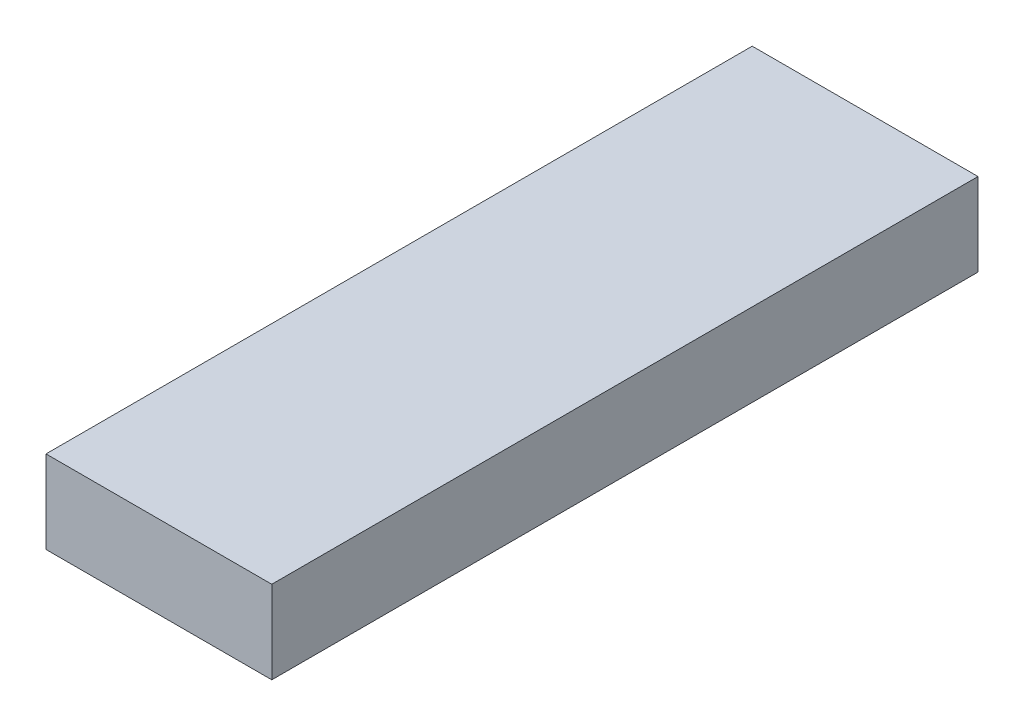
ISO-10303-21;
HEADER;
FILE_DESCRIPTION(('STEP AP214'),'2;1');
FILE_NAME('part.step','',(''),(''),'','','');
FILE_SCHEMA(('AUTOMOTIVE_DESIGN { 1 0 10303 214 1 1 1 1 }'));
ENDSEC;
DATA;
#1=APPLICATION_CONTEXT('core data for automotive mechanical design processes');
#2=APPLICATION_PROTOCOL_DEFINITION('international standard','automotive_design',2000,#1);
#3=PRODUCT_CONTEXT('',#1,'mechanical');
#4=PRODUCT('Part','Part','',(#3));
#5=PRODUCT_RELATED_PRODUCT_CATEGORY('part','',(#4));
#6=PRODUCT_DEFINITION_FORMATION('','',#4);
#7=PRODUCT_DEFINITION_CONTEXT('part definition',#1,'design');
#8=PRODUCT_DEFINITION('design','',#6,#7);
#9=PRODUCT_DEFINITION_SHAPE('','',#8);
#10=(LENGTH_UNIT() NAMED_UNIT(*) SI_UNIT(.MILLI.,.METRE.));
#11=(NAMED_UNIT(*) PLANE_ANGLE_UNIT() SI_UNIT($,.RADIAN.));
#12=(NAMED_UNIT(*) SI_UNIT($,.STERADIAN.) SOLID_ANGLE_UNIT());
#13=UNCERTAINTY_MEASURE_WITH_UNIT(LENGTH_MEASURE(1.E-05),#10,'distance_accuracy_value','');
#14=(GEOMETRIC_REPRESENTATION_CONTEXT(3) GLOBAL_UNCERTAINTY_ASSIGNED_CONTEXT((#13)) GLOBAL_UNIT_ASSIGNED_CONTEXT((#10,
#11,#12)) REPRESENTATION_CONTEXT('',''));
#15=CARTESIAN_POINT('',(0.,0.,0.));
#16=DIRECTION('',(0.,0.,1.));
#17=DIRECTION('',(1.,0.,0.));
#18=AXIS2_PLACEMENT_3D('',#15,#16,#17);
#19=CARTESIAN_POINT('',(0.,139.7,0.));
#20=DIRECTION('',(1.,0.,0.));
#21=DIRECTION('',(0.,0.,-1.));
#22=AXIS2_PLACEMENT_3D('',#19,#20,#21);
#23=PLANE('',#22);
#24=DIRECTION('',(0.,0.,1.));
#25=VECTOR('',#24,1.);
#26=CARTESIAN_POINT('',(0.,0.,0.));
#27=LINE('',#26,#25);
#28=CARTESIAN_POINT('',(0.,0.,-1191.768));
#29=VERTEX_POINT('',#28);
#30=CARTESIAN_POINT('',(0.,0.,0.));
#31=VERTEX_POINT('',#30);
#32=EDGE_CURVE('E103',#29,#31,#27,.T.);
#33=ORIENTED_EDGE('',*,*,#32,.T.);
#34=DIRECTION('',(0.,-1.,0.));
#35=VECTOR('',#34,1.);
#36=CARTESIAN_POINT('',(0.,139.7,0.));
#37=LINE('',#36,#35);
#38=CARTESIAN_POINT('',(0.,139.7,0.));
#39=VERTEX_POINT('',#38);
#40=EDGE_CURVE('E11',#39,#31,#37,.T.);
#41=ORIENTED_EDGE('',*,*,#40,.F.);
#42=DIRECTION('',(0.,0.,1.));
#43=VECTOR('',#42,1.);
#44=CARTESIAN_POINT('',(0.,139.7,0.));
#45=LINE('',#44,#43);
#46=CARTESIAN_POINT('',(0.,139.7,-1191.768));
#47=VERTEX_POINT('',#46);
#48=EDGE_CURVE('E91',#47,#39,#45,.T.);
#49=ORIENTED_EDGE('',*,*,#48,.F.);
#50=DIRECTION('',(0.,-1.,0.));
#51=VECTOR('',#50,1.);
#52=CARTESIAN_POINT('',(0.,139.7,-1191.768));
#53=LINE('',#52,#51);
#54=EDGE_CURVE('E99',#47,#29,#53,.T.);
#55=ORIENTED_EDGE('',*,*,#54,.T.);
#56=EDGE_LOOP('',(#33,#41,#49,#55));
#57=FACE_BOUND('',#56,.T.);
#58=ADVANCED_FACE('F40',(#57),#23,.F.);
#59=CARTESIAN_POINT('',(0.,139.7,0.));
#60=DIRECTION('',(0.,0.,-1.));
#61=DIRECTION('',(-1.,0.,0.));
#62=AXIS2_PLACEMENT_3D('',#59,#60,#61);
#63=PLANE('',#62);
#64=DIRECTION('',(1.,0.,0.));
#65=VECTOR('',#64,1.);
#66=CARTESIAN_POINT('',(0.,0.,0.));
#67=LINE('',#66,#65);
#68=CARTESIAN_POINT('',(381.,0.,0.));
#69=VERTEX_POINT('',#68);
#70=EDGE_CURVE('E95',#31,#69,#67,.T.);
#71=ORIENTED_EDGE('',*,*,#70,.T.);
#72=DIRECTION('',(0.,-1.,0.));
#73=VECTOR('',#72,1.);
#74=CARTESIAN_POINT('',(381.,139.7,0.));
#75=LINE('',#74,#73);
#76=CARTESIAN_POINT('',(381.,139.7,0.));
#77=VERTEX_POINT('',#76);
#78=EDGE_CURVE('E48',#77,#69,#75,.T.);
#79=ORIENTED_EDGE('',*,*,#78,.F.);
#80=DIRECTION('',(1.,0.,0.));
#81=VECTOR('',#80,1.);
#82=CARTESIAN_POINT('',(0.,139.7,0.));
#83=LINE('',#82,#81);
#84=EDGE_CURVE('E86',#39,#77,#83,.T.);
#85=ORIENTED_EDGE('',*,*,#84,.F.);
#86=ORIENTED_EDGE('',*,*,#40,.T.);
#87=EDGE_LOOP('',(#71,#79,#85,#86));
#88=FACE_BOUND('',#87,.T.);
#89=ADVANCED_FACE('F94',(#88),#63,.F.);
#90=CARTESIAN_POINT('',(381.,139.7,0.));
#91=DIRECTION('',(-1.,0.,0.));
#92=DIRECTION('',(0.,0.,1.));
#93=AXIS2_PLACEMENT_3D('',#90,#91,#92);
#94=PLANE('',#93);
#95=DIRECTION('',(0.,0.,-1.));
#96=VECTOR('',#95,1.);
#97=CARTESIAN_POINT('',(381.,0.,0.));
#98=LINE('',#97,#96);
#99=CARTESIAN_POINT('',(381.,0.,-1191.768));
#100=VERTEX_POINT('',#99);
#101=EDGE_CURVE('E73',#69,#100,#98,.T.);
#102=ORIENTED_EDGE('',*,*,#101,.T.);
#103=DIRECTION('',(0.,-1.,0.));
#104=VECTOR('',#103,1.);
#105=CARTESIAN_POINT('',(381.,139.7,-1191.768));
#106=LINE('',#105,#104);
#107=CARTESIAN_POINT('',(381.,139.7,-1191.768));
#108=VERTEX_POINT('',#107);
#109=EDGE_CURVE('E96',#108,#100,#106,.T.);
#110=ORIENTED_EDGE('',*,*,#109,.F.);
#111=DIRECTION('',(0.,0.,-1.));
#112=VECTOR('',#111,1.);
#113=CARTESIAN_POINT('',(381.,139.7,0.));
#114=LINE('',#113,#112);
#115=EDGE_CURVE('E89',#77,#108,#114,.T.);
#116=ORIENTED_EDGE('',*,*,#115,.F.);
#117=ORIENTED_EDGE('',*,*,#78,.T.);
#118=EDGE_LOOP('',(#102,#110,#116,#117));
#119=FACE_BOUND('',#118,.T.);
#120=ADVANCED_FACE('F97',(#119),#94,.F.);
#121=CARTESIAN_POINT('',(0.,139.7,-1191.768));
#122=DIRECTION('',(0.,0.,1.));
#123=DIRECTION('',(1.,0.,0.));
#124=AXIS2_PLACEMENT_3D('',#121,#122,#123);
#125=PLANE('',#124);
#126=DIRECTION('',(-1.,0.,0.));
#127=VECTOR('',#126,1.);
#128=CARTESIAN_POINT('',(0.,0.,-1191.768));
#129=LINE('',#128,#127);
#130=EDGE_CURVE('E79',#100,#29,#129,.T.);
#131=ORIENTED_EDGE('',*,*,#130,.T.);
#132=ORIENTED_EDGE('',*,*,#54,.F.);
#133=DIRECTION('',(-1.,0.,0.));
#134=VECTOR('',#133,1.);
#135=CARTESIAN_POINT('',(0.,139.7,-1191.768));
#136=LINE('',#135,#134);
#137=EDGE_CURVE('E56',#108,#47,#136,.T.);
#138=ORIENTED_EDGE('',*,*,#137,.F.);
#139=ORIENTED_EDGE('',*,*,#109,.T.);
#140=EDGE_LOOP('',(#131,#132,#138,#139));
#141=FACE_BOUND('',#140,.T.);
#142=ADVANCED_FACE('F110',(#141),#125,.F.);
#143=CARTESIAN_POINT('',(0.,139.7,0.));
#144=DIRECTION('',(0.,-1.,0.));
#145=DIRECTION('',(0.,0.,-1.));
#146=AXIS2_PLACEMENT_3D('',#143,#144,#145);
#147=PLANE('',#146);
#148=ORIENTED_EDGE('',*,*,#48,.T.);
#149=ORIENTED_EDGE('',*,*,#84,.T.);
#150=ORIENTED_EDGE('',*,*,#115,.T.);
#151=ORIENTED_EDGE('',*,*,#137,.T.);
#152=EDGE_LOOP('',(#148,#149,#150,#151));
#153=FACE_BOUND('',#152,.T.);
#154=ADVANCED_FACE('F87',(#153),#147,.F.);
#155=CARTESIAN_POINT('',(0.,0.,0.));
#156=DIRECTION('',(0.,-1.,0.));
#157=DIRECTION('',(0.,0.,-1.));
#158=AXIS2_PLACEMENT_3D('',#155,#156,#157);
#159=PLANE('',#158);
#160=ORIENTED_EDGE('',*,*,#32,.F.);
#161=ORIENTED_EDGE('',*,*,#130,.F.);
#162=ORIENTED_EDGE('',*,*,#101,.F.);
#163=ORIENTED_EDGE('',*,*,#70,.F.);
#164=EDGE_LOOP('',(#160,#161,#162,#163));
#165=FACE_BOUND('',#164,.T.);
#166=ADVANCED_FACE('F113',(#165),#159,.T.);
#167=CLOSED_SHELL('',(#58,#89,#120,#142,#154,#166));
#168=MANIFOLD_SOLID_BREP('B2',#167);
#169=ADVANCED_BREP_SHAPE_REPRESENTATION('',(#18,#168),#14);
#170=SHAPE_DEFINITION_REPRESENTATION(#9,#169);
ENDSEC;
END-ISO-10303-21;
